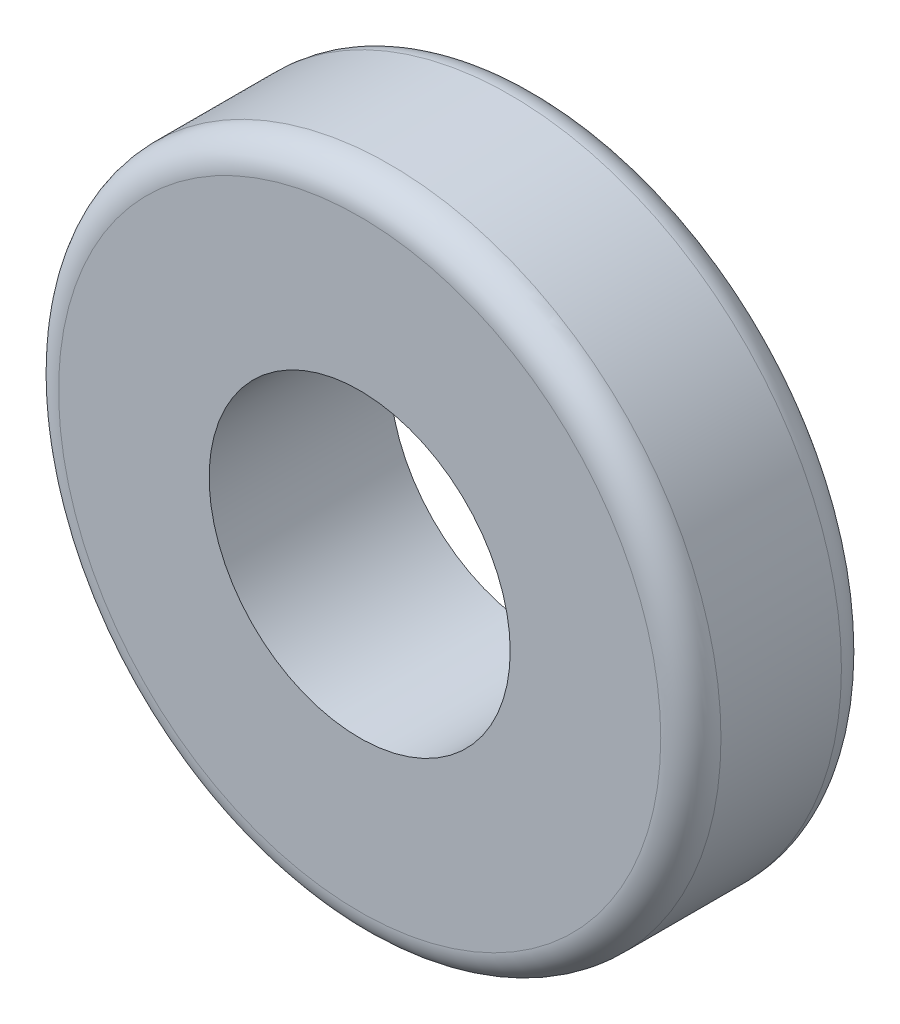
ISO-10303-21;
HEADER;
FILE_DESCRIPTION(('STEP AP214'),'2;1');
FILE_NAME('part.step','',(''),(''),'','','');
FILE_SCHEMA(('AUTOMOTIVE_DESIGN { 1 0 10303 214 1 1 1 1 }'));
ENDSEC;
DATA;
#1=APPLICATION_CONTEXT('core data for automotive mechanical design processes');
#2=APPLICATION_PROTOCOL_DEFINITION('international standard','automotive_design',2000,#1);
#3=PRODUCT_CONTEXT('',#1,'mechanical');
#4=PRODUCT('Part','Part','',(#3));
#5=PRODUCT_RELATED_PRODUCT_CATEGORY('part','',(#4));
#6=PRODUCT_DEFINITION_FORMATION('','',#4);
#7=PRODUCT_DEFINITION_CONTEXT('part definition',#1,'design');
#8=PRODUCT_DEFINITION('design','',#6,#7);
#9=PRODUCT_DEFINITION_SHAPE('','',#8);
#10=(LENGTH_UNIT() NAMED_UNIT(*) SI_UNIT(.MILLI.,.METRE.));
#11=(NAMED_UNIT(*) PLANE_ANGLE_UNIT() SI_UNIT($,.RADIAN.));
#12=(NAMED_UNIT(*) SI_UNIT($,.STERADIAN.) SOLID_ANGLE_UNIT());
#13=UNCERTAINTY_MEASURE_WITH_UNIT(LENGTH_MEASURE(1.E-05),#10,'distance_accuracy_value','');
#14=(GEOMETRIC_REPRESENTATION_CONTEXT(3) GLOBAL_UNCERTAINTY_ASSIGNED_CONTEXT((#13)) GLOBAL_UNIT_ASSIGNED_CONTEXT((#10,
#11,#12)) REPRESENTATION_CONTEXT('',''));
#15=CARTESIAN_POINT('',(0.,0.,0.));
#16=DIRECTION('',(0.,0.,1.));
#17=DIRECTION('',(1.,0.,0.));
#18=AXIS2_PLACEMENT_3D('',#15,#16,#17);
#19=CARTESIAN_POINT('',(0.,0.,6.));
#20=DIRECTION('',(0.,0.,1.));
#21=DIRECTION('',(1.,0.,0.));
#22=AXIS2_PLACEMENT_3D('',#19,#20,#21);
#23=PLANE('',#22);
#24=CARTESIAN_POINT('',(0.,0.,6.));
#25=DIRECTION('',(0.,0.,1.));
#26=DIRECTION('',(1.,0.,0.));
#27=AXIS2_PLACEMENT_3D('',#24,#25,#26);
#28=CIRCLE('',#27,10.);
#29=CARTESIAN_POINT('',(10.,0.,6.));
#30=VERTEX_POINT('',#29);
#31=EDGE_CURVE('E10',#30,#30,#28,.T.);
#32=ORIENTED_EDGE('',*,*,#31,.T.);
#33=EDGE_LOOP('',(#32));
#34=FACE_BOUND('',#33,.T.);
#35=CARTESIAN_POINT('',(0.,0.,6.));
#36=DIRECTION('',(0.,0.,1.));
#37=DIRECTION('',(1.,0.,0.));
#38=AXIS2_PLACEMENT_3D('',#35,#36,#37);
#39=CIRCLE('',#38,5.);
#40=CARTESIAN_POINT('',(5.,0.,6.));
#41=VERTEX_POINT('',#40);
#42=EDGE_CURVE('E57',#41,#41,#39,.T.);
#43=ORIENTED_EDGE('',*,*,#42,.F.);
#44=EDGE_LOOP('',(#43));
#45=FACE_BOUND('',#44,.T.);
#46=ADVANCED_FACE('F37',(#34,#45),#23,.T.);
#47=CARTESIAN_POINT('',(0.,0.,0.));
#48=DIRECTION('',(0.,0.,1.));
#49=DIRECTION('',(1.,0.,0.));
#50=AXIS2_PLACEMENT_3D('',#47,#48,#49);
#51=PLANE('',#50);
#52=CARTESIAN_POINT('',(0.,0.,0.));
#53=DIRECTION('',(0.,0.,1.));
#54=DIRECTION('',(1.,0.,0.));
#55=AXIS2_PLACEMENT_3D('',#52,#53,#54);
#56=CIRCLE('',#55,10.);
#57=CARTESIAN_POINT('',(10.,0.,0.));
#58=VERTEX_POINT('',#57);
#59=EDGE_CURVE('E44',#58,#58,#56,.F.);
#60=ORIENTED_EDGE('',*,*,#59,.T.);
#61=EDGE_LOOP('',(#60));
#62=FACE_BOUND('',#61,.T.);
#63=CARTESIAN_POINT('',(0.,0.,0.));
#64=DIRECTION('',(0.,0.,1.));
#65=DIRECTION('',(1.,0.,0.));
#66=AXIS2_PLACEMENT_3D('',#63,#64,#65);
#67=CIRCLE('',#66,5.);
#68=CARTESIAN_POINT('',(5.,0.,0.));
#69=VERTEX_POINT('',#68);
#70=EDGE_CURVE('E58',#69,#69,#67,.T.);
#71=ORIENTED_EDGE('',*,*,#70,.T.);
#72=EDGE_LOOP('',(#71));
#73=FACE_BOUND('',#72,.T.);
#74=ADVANCED_FACE('F68',(#62,#73),#51,.F.);
#75=CARTESIAN_POINT('',(0.,0.,6.));
#76=DIRECTION('',(0.,0.,-1.));
#77=DIRECTION('',(-1.,0.,0.));
#78=AXIS2_PLACEMENT_3D('',#75,#76,#77);
#79=CYLINDRICAL_SURFACE('',#78,11.);
#80=CARTESIAN_POINT('',(0.,0.,1.));
#81=DIRECTION('',(0.,0.,1.));
#82=DIRECTION('',(1.,0.,0.));
#83=AXIS2_PLACEMENT_3D('',#80,#81,#82);
#84=CIRCLE('',#83,11.);
#85=CARTESIAN_POINT('',(11.,0.,1.));
#86=VERTEX_POINT('',#85);
#87=EDGE_CURVE('E48',#86,#86,#84,.T.);
#88=ORIENTED_EDGE('',*,*,#87,.T.);
#89=EDGE_LOOP('',(#88));
#90=FACE_BOUND('',#89,.T.);
#91=CARTESIAN_POINT('',(0.,0.,5.));
#92=DIRECTION('',(0.,0.,1.));
#93=DIRECTION('',(1.,0.,0.));
#94=AXIS2_PLACEMENT_3D('',#91,#92,#93);
#95=CIRCLE('',#94,11.);
#96=CARTESIAN_POINT('',(11.,0.,5.));
#97=VERTEX_POINT('',#96);
#98=EDGE_CURVE('E52',#97,#97,#95,.F.);
#99=ORIENTED_EDGE('',*,*,#98,.T.);
#100=EDGE_LOOP('',(#99));
#101=FACE_BOUND('',#100,.T.);
#102=ADVANCED_FACE('F74',(#90,#101),#79,.T.);
#103=CARTESIAN_POINT('',(0.,0.,6.));
#104=DIRECTION('',(0.,0.,-1.));
#105=DIRECTION('',(-1.,0.,0.));
#106=AXIS2_PLACEMENT_3D('',#103,#104,#105);
#107=CYLINDRICAL_SURFACE('',#106,5.);
#108=ORIENTED_EDGE('',*,*,#42,.T.);
#109=EDGE_LOOP('',(#108));
#110=FACE_BOUND('',#109,.T.);
#111=ORIENTED_EDGE('',*,*,#70,.F.);
#112=EDGE_LOOP('',(#111));
#113=FACE_BOUND('',#112,.T.);
#114=ADVANCED_FACE('F64',(#110,#113),#107,.F.);
#115=CARTESIAN_POINT('',(0.,0.,1.));
#116=DIRECTION('',(0.,0.,1.));
#117=DIRECTION('',(1.,0.,0.));
#118=AXIS2_PLACEMENT_3D('',#115,#116,#117);
#119=TOROIDAL_SURFACE('',#118,10.,1.);
#120=ORIENTED_EDGE('',*,*,#59,.F.);
#121=EDGE_LOOP('',(#120));
#122=FACE_BOUND('',#121,.T.);
#123=ORIENTED_EDGE('',*,*,#87,.F.);
#124=EDGE_LOOP('',(#123));
#125=FACE_BOUND('',#124,.T.);
#126=ADVANCED_FACE('F80',(#122,#125),#119,.T.);
#127=CARTESIAN_POINT('',(0.,0.,5.));
#128=DIRECTION('',(0.,0.,1.));
#129=DIRECTION('',(1.,0.,0.));
#130=AXIS2_PLACEMENT_3D('',#127,#128,#129);
#131=TOROIDAL_SURFACE('',#130,10.,1.);
#132=ORIENTED_EDGE('',*,*,#98,.F.);
#133=EDGE_LOOP('',(#132));
#134=FACE_BOUND('',#133,.T.);
#135=ORIENTED_EDGE('',*,*,#31,.F.);
#136=EDGE_LOOP('',(#135));
#137=FACE_BOUND('',#136,.T.);
#138=ADVANCED_FACE('F39',(#134,#137),#131,.T.);
#139=CLOSED_SHELL('',(#46,#74,#102,#114,#126,#138));
#140=MANIFOLD_SOLID_BREP('B2',#139);
#141=ADVANCED_BREP_SHAPE_REPRESENTATION('',(#18,#140),#14);
#142=SHAPE_DEFINITION_REPRESENTATION(#9,#141);
ENDSEC;
END-ISO-10303-21;
